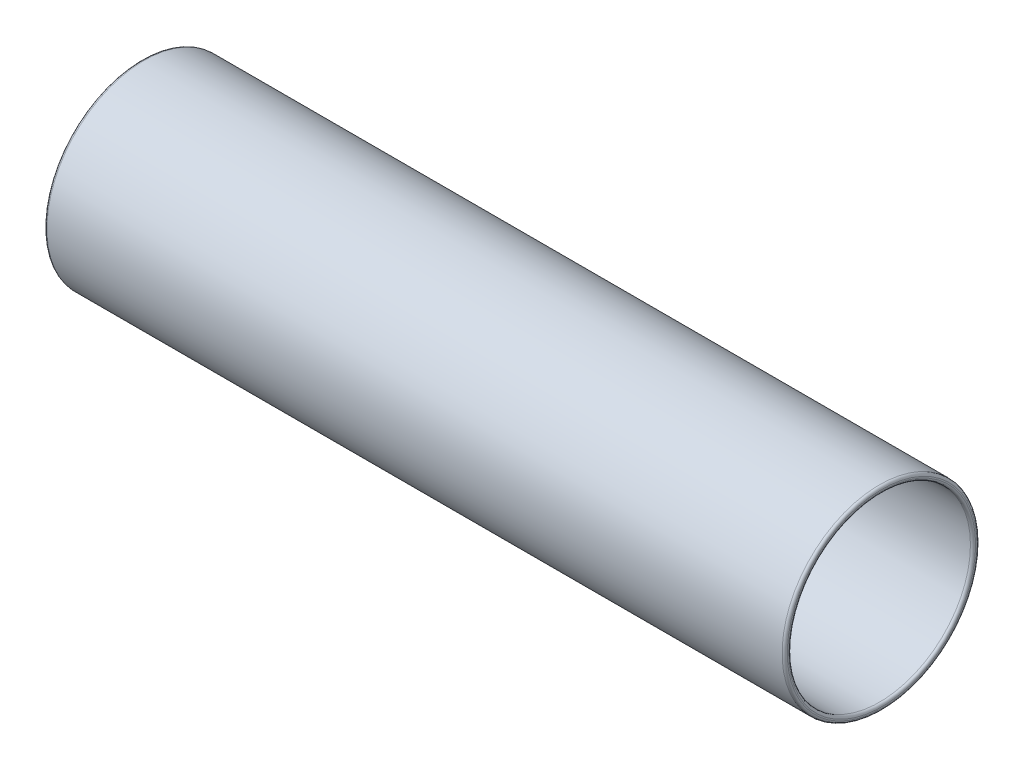
ISO-10303-21;
HEADER;
FILE_DESCRIPTION(('STEP AP214'),'2;1');
FILE_NAME('part.step','',(''),(''),'','','');
FILE_SCHEMA(('AUTOMOTIVE_DESIGN { 1 0 10303 214 1 1 1 1 }'));
ENDSEC;
DATA;
#1=APPLICATION_CONTEXT('core data for automotive mechanical design processes');
#2=APPLICATION_PROTOCOL_DEFINITION('international standard','automotive_design',2000,#1);
#3=PRODUCT_CONTEXT('',#1,'mechanical');
#4=PRODUCT('Part','Part','',(#3));
#5=PRODUCT_RELATED_PRODUCT_CATEGORY('part','',(#4));
#6=PRODUCT_DEFINITION_FORMATION('','',#4);
#7=PRODUCT_DEFINITION_CONTEXT('part definition',#1,'design');
#8=PRODUCT_DEFINITION('design','',#6,#7);
#9=PRODUCT_DEFINITION_SHAPE('','',#8);
#10=(LENGTH_UNIT() NAMED_UNIT(*) SI_UNIT(.MILLI.,.METRE.));
#11=(NAMED_UNIT(*) PLANE_ANGLE_UNIT() SI_UNIT($,.RADIAN.));
#12=(NAMED_UNIT(*) SI_UNIT($,.STERADIAN.) SOLID_ANGLE_UNIT());
#13=UNCERTAINTY_MEASURE_WITH_UNIT(LENGTH_MEASURE(1.E-05),#10,'distance_accuracy_value','');
#14=(GEOMETRIC_REPRESENTATION_CONTEXT(3) GLOBAL_UNCERTAINTY_ASSIGNED_CONTEXT((#13)) GLOBAL_UNIT_ASSIGNED_CONTEXT((#10,
#11,#12)) REPRESENTATION_CONTEXT('',''));
#15=CARTESIAN_POINT('',(0.,0.,0.));
#16=DIRECTION('',(0.,0.,1.));
#17=DIRECTION('',(1.,0.,0.));
#18=AXIS2_PLACEMENT_3D('',#15,#16,#17);
#19=CARTESIAN_POINT('',(-158.684210526312,0.,0.));
#20=DIRECTION('',(1.,0.,0.));
#21=DIRECTION('',(0.,0.,-1.));
#22=AXIS2_PLACEMENT_3D('',#19,#20,#21);
#23=PLANE('',#22);
#24=CARTESIAN_POINT('',(-158.684210526312,0.,0.));
#25=DIRECTION('',(1.,0.,0.));
#26=DIRECTION('',(0.,0.,-1.));
#27=AXIS2_PLACEMENT_3D('',#24,#25,#26);
#28=CIRCLE('',#27,72.);
#29=CARTESIAN_POINT('',(-158.684210526312,0.,-72.));
#30=VERTEX_POINT('',#29);
#31=EDGE_CURVE('E87',#30,#30,#28,.T.);
#32=ORIENTED_EDGE('',*,*,#31,.T.);
#33=EDGE_LOOP('',(#32));
#34=FACE_BOUND('',#33,.T.);
#35=CARTESIAN_POINT('',(-158.684210526312,0.,0.));
#36=DIRECTION('',(1.,0.,0.));
#37=DIRECTION('',(0.,0.,-1.));
#38=AXIS2_PLACEMENT_3D('',#35,#36,#37);
#39=CIRCLE('',#38,73.);
#40=CARTESIAN_POINT('',(-158.684210526312,0.,-73.));
#41=VERTEX_POINT('',#40);
#42=EDGE_CURVE('E91',#41,#41,#39,.F.);
#43=ORIENTED_EDGE('',*,*,#42,.T.);
#44=EDGE_LOOP('',(#43));
#45=FACE_BOUND('',#44,.T.);
#46=ADVANCED_FACE('F61',(#34,#45),#23,.F.);
#47=CARTESIAN_POINT('',(0.,0.,0.));
#48=DIRECTION('',(-1.,0.,0.));
#49=DIRECTION('',(0.,0.,1.));
#50=AXIS2_PLACEMENT_3D('',#47,#48,#49);
#51=CYLINDRICAL_SURFACE('',#50,70.);
#52=CARTESIAN_POINT('',(-156.684210526312,0.,0.));
#53=DIRECTION('',(1.,0.,0.));
#54=DIRECTION('',(0.,0.,-1.));
#55=AXIS2_PLACEMENT_3D('',#52,#53,#54);
#56=CIRCLE('',#55,70.);
#57=CARTESIAN_POINT('',(-156.684210526312,0.,-70.));
#58=VERTEX_POINT('',#57);
#59=EDGE_CURVE('E95',#58,#58,#56,.F.);
#60=ORIENTED_EDGE('',*,*,#59,.T.);
#61=EDGE_LOOP('',(#60));
#62=FACE_BOUND('',#61,.T.);
#63=CARTESIAN_POINT('',(409.315789473688,0.,0.));
#64=DIRECTION('',(1.,0.,0.));
#65=DIRECTION('',(0.,0.,-1.));
#66=AXIS2_PLACEMENT_3D('',#63,#64,#65);
#67=CIRCLE('',#66,70.);
#68=CARTESIAN_POINT('',(409.315789473688,0.,-70.));
#69=VERTEX_POINT('',#68);
#70=EDGE_CURVE('E99',#69,#69,#67,.T.);
#71=ORIENTED_EDGE('',*,*,#70,.T.);
#72=EDGE_LOOP('',(#71));
#73=FACE_BOUND('',#72,.T.);
#74=ADVANCED_FACE('F105',(#62,#73),#51,.F.);
#75=CARTESIAN_POINT('',(411.315789473688,0.,0.));
#76=DIRECTION('',(1.,0.,0.));
#77=DIRECTION('',(0.,0.,-1.));
#78=AXIS2_PLACEMENT_3D('',#75,#76,#77);
#79=PLANE('',#78);
#80=CARTESIAN_POINT('',(411.315789473688,0.,0.));
#81=DIRECTION('',(1.,0.,0.));
#82=DIRECTION('',(0.,0.,-1.));
#83=AXIS2_PLACEMENT_3D('',#80,#81,#82);
#84=CIRCLE('',#83,72.);
#85=CARTESIAN_POINT('',(411.315789473688,0.,-72.));
#86=VERTEX_POINT('',#85);
#87=EDGE_CURVE('E10',#86,#86,#84,.F.);
#88=ORIENTED_EDGE('',*,*,#87,.T.);
#89=EDGE_LOOP('',(#88));
#90=FACE_BOUND('',#89,.T.);
#91=CARTESIAN_POINT('',(411.315789473688,0.,0.));
#92=DIRECTION('',(1.,0.,0.));
#93=DIRECTION('',(0.,0.,-1.));
#94=AXIS2_PLACEMENT_3D('',#91,#92,#93);
#95=CIRCLE('',#94,73.);
#96=CARTESIAN_POINT('',(411.315789473688,0.,-73.));
#97=VERTEX_POINT('',#96);
#98=EDGE_CURVE('E69',#97,#97,#95,.T.);
#99=ORIENTED_EDGE('',*,*,#98,.T.);
#100=EDGE_LOOP('',(#99));
#101=FACE_BOUND('',#100,.T.);
#102=ADVANCED_FACE('F125',(#90,#101),#79,.T.);
#103=CARTESIAN_POINT('',(0.,0.,0.));
#104=DIRECTION('',(-1.,0.,0.));
#105=DIRECTION('',(0.,0.,1.));
#106=AXIS2_PLACEMENT_3D('',#103,#104,#105);
#107=CYLINDRICAL_SURFACE('',#106,75.);
#108=CARTESIAN_POINT('',(-156.684210526312,0.,0.));
#109=DIRECTION('',(1.,0.,0.));
#110=DIRECTION('',(0.,0.,-1.));
#111=AXIS2_PLACEMENT_3D('',#108,#109,#110);
#112=CIRCLE('',#111,75.);
#113=CARTESIAN_POINT('',(-156.684210526312,0.,-75.));
#114=VERTEX_POINT('',#113);
#115=EDGE_CURVE('E75',#114,#114,#112,.T.);
#116=ORIENTED_EDGE('',*,*,#115,.T.);
#117=EDGE_LOOP('',(#116));
#118=FACE_BOUND('',#117,.T.);
#119=CARTESIAN_POINT('',(409.315789473688,0.,0.));
#120=DIRECTION('',(1.,0.,0.));
#121=DIRECTION('',(0.,0.,-1.));
#122=AXIS2_PLACEMENT_3D('',#119,#120,#121);
#123=CIRCLE('',#122,75.);
#124=CARTESIAN_POINT('',(409.315789473688,0.,-75.));
#125=VERTEX_POINT('',#124);
#126=EDGE_CURVE('E81',#125,#125,#123,.F.);
#127=ORIENTED_EDGE('',*,*,#126,.T.);
#128=EDGE_LOOP('',(#127));
#129=FACE_BOUND('',#128,.T.);
#130=ADVANCED_FACE('F132',(#118,#129),#107,.T.);
#131=CARTESIAN_POINT('',(-156.684210526312,0.,0.));
#132=DIRECTION('',(1.,0.,0.));
#133=DIRECTION('',(0.,0.,-1.));
#134=AXIS2_PLACEMENT_3D('',#131,#132,#133);
#135=TOROIDAL_SURFACE('',#134,72.,2.);
#136=ORIENTED_EDGE('',*,*,#31,.F.);
#137=EDGE_LOOP('',(#136));
#138=FACE_BOUND('',#137,.T.);
#139=ORIENTED_EDGE('',*,*,#59,.F.);
#140=EDGE_LOOP('',(#139));
#141=FACE_BOUND('',#140,.T.);
#142=ADVANCED_FACE('F116',(#138,#141),#135,.T.);
#143=CARTESIAN_POINT('',(-156.684210526312,0.,0.));
#144=DIRECTION('',(1.,0.,0.));
#145=DIRECTION('',(0.,0.,-1.));
#146=AXIS2_PLACEMENT_3D('',#143,#144,#145);
#147=TOROIDAL_SURFACE('',#146,73.,2.);
#148=ORIENTED_EDGE('',*,*,#115,.F.);
#149=EDGE_LOOP('',(#148));
#150=FACE_BOUND('',#149,.T.);
#151=ORIENTED_EDGE('',*,*,#42,.F.);
#152=EDGE_LOOP('',(#151));
#153=FACE_BOUND('',#152,.T.);
#154=ADVANCED_FACE('F110',(#150,#153),#147,.T.);
#155=CARTESIAN_POINT('',(409.315789473688,0.,0.));
#156=DIRECTION('',(1.,0.,0.));
#157=DIRECTION('',(0.,0.,-1.));
#158=AXIS2_PLACEMENT_3D('',#155,#156,#157);
#159=TOROIDAL_SURFACE('',#158,72.,2.);
#160=ORIENTED_EDGE('',*,*,#70,.F.);
#161=EDGE_LOOP('',(#160));
#162=FACE_BOUND('',#161,.T.);
#163=ORIENTED_EDGE('',*,*,#87,.F.);
#164=EDGE_LOOP('',(#163));
#165=FACE_BOUND('',#164,.T.);
#166=ADVANCED_FACE('F107',(#162,#165),#159,.T.);
#167=CARTESIAN_POINT('',(409.315789473688,0.,0.));
#168=DIRECTION('',(1.,0.,0.));
#169=DIRECTION('',(0.,0.,-1.));
#170=AXIS2_PLACEMENT_3D('',#167,#168,#169);
#171=TOROIDAL_SURFACE('',#170,73.,2.);
#172=ORIENTED_EDGE('',*,*,#98,.F.);
#173=EDGE_LOOP('',(#172));
#174=FACE_BOUND('',#173,.T.);
#175=ORIENTED_EDGE('',*,*,#126,.F.);
#176=EDGE_LOOP('',(#175));
#177=FACE_BOUND('',#176,.T.);
#178=ADVANCED_FACE('F63',(#174,#177),#171,.T.);
#179=CLOSED_SHELL('',(#46,#74,#102,#130,#142,#154,#166,#178));
#180=MANIFOLD_SOLID_BREP('B2',#179);
#181=ADVANCED_BREP_SHAPE_REPRESENTATION('',(#18,#180),#14);
#182=SHAPE_DEFINITION_REPRESENTATION(#9,#181);
ENDSEC;
END-ISO-10303-21;
